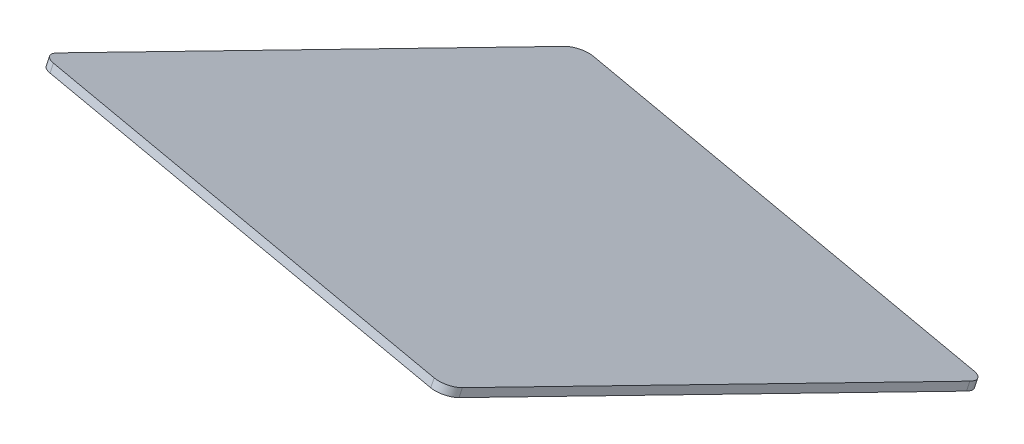
ISO-10303-21;
HEADER;
FILE_DESCRIPTION(('STEP AP214'),'2;1');
FILE_NAME('part.step','',(''),(''),'','','');
FILE_SCHEMA(('AUTOMOTIVE_DESIGN { 1 0 10303 214 1 1 1 1 }'));
ENDSEC;
DATA;
#1=APPLICATION_CONTEXT('core data for automotive mechanical design processes');
#2=APPLICATION_PROTOCOL_DEFINITION('international standard','automotive_design',2000,#1);
#3=PRODUCT_CONTEXT('',#1,'mechanical');
#4=PRODUCT('Part','Part','',(#3));
#5=PRODUCT_RELATED_PRODUCT_CATEGORY('part','',(#4));
#6=PRODUCT_DEFINITION_FORMATION('','',#4);
#7=PRODUCT_DEFINITION_CONTEXT('part definition',#1,'design');
#8=PRODUCT_DEFINITION('design','',#6,#7);
#9=PRODUCT_DEFINITION_SHAPE('','',#8);
#10=(LENGTH_UNIT() NAMED_UNIT(*) SI_UNIT(.MILLI.,.METRE.));
#11=(NAMED_UNIT(*) PLANE_ANGLE_UNIT() SI_UNIT($,.RADIAN.));
#12=(NAMED_UNIT(*) SI_UNIT($,.STERADIAN.) SOLID_ANGLE_UNIT());
#13=UNCERTAINTY_MEASURE_WITH_UNIT(LENGTH_MEASURE(1.E-05),#10,'distance_accuracy_value','');
#14=(GEOMETRIC_REPRESENTATION_CONTEXT(3) GLOBAL_UNCERTAINTY_ASSIGNED_CONTEXT((#13)) GLOBAL_UNIT_ASSIGNED_CONTEXT((#10,
#11,#12)) REPRESENTATION_CONTEXT('',''));
#15=CARTESIAN_POINT('',(0.,0.,0.));
#16=DIRECTION('',(0.,0.,1.));
#17=DIRECTION('',(1.,0.,0.));
#18=AXIS2_PLACEMENT_3D('',#15,#16,#17);
#19=CARTESIAN_POINT('',(-350.951861211952,-116.026821900405,195.378769077398));
#20=DIRECTION('',(0.0638061756262259,0.931035020271879,-0.359308451026827));
#21=DIRECTION('',(0.,0.360042105265539,0.932936054848326));
#22=AXIS2_PLACEMENT_3D('',#19,#20,#21);
#23=CYLINDRICAL_SURFACE('',#22,3.);
#24=CARTESIAN_POINT('',(-350.84977133095,-114.53716586797,194.803875555755));
#25=DIRECTION('',(-0.0638061756262259,-0.931035020271879,0.359308451026827));
#26=DIRECTION('',(0.,-0.360042105265539,-0.932936054848326));
#27=AXIS2_PLACEMENT_3D('',#24,#25,#26);
#28=CIRCLE('',#27,3.);
#29=CARTESIAN_POINT('',(-353.803559218846,-114.53716586797,194.279340415545));
#30=VERTEX_POINT('',#29);
#31=CARTESIAN_POINT('',(-350.361410746052,-115.63195539991,192.053795589668));
#32=VERTEX_POINT('',#31);
#33=EDGE_CURVE('E131',#30,#32,#28,.T.);
#34=ORIENTED_EDGE('',*,*,#33,.T.);
#35=DIRECTION('',(0.0638061756262259,0.931035020271879,-0.359308451026827));
#36=VECTOR('',#35,1.);
#37=CARTESIAN_POINT('',(-350.463500627054,-117.121611432345,192.628689111311));
#38=LINE('',#37,#36);
#39=CARTESIAN_POINT('',(-350.463500627054,-117.121611432345,192.628689111311));
#40=VERTEX_POINT('',#39);
#41=EDGE_CURVE('E11',#40,#32,#38,.T.);
#42=ORIENTED_EDGE('',*,*,#41,.F.);
#43=CARTESIAN_POINT('',(-350.951861211952,-116.026821900405,195.378769077398));
#44=DIRECTION('',(-0.0638061756262259,-0.931035020271879,0.359308451026827));
#45=DIRECTION('',(0.,-0.360042105265539,-0.932936054848326));
#46=AXIS2_PLACEMENT_3D('',#43,#44,#45);
#47=CIRCLE('',#46,3.);
#48=CARTESIAN_POINT('',(-353.905649099848,-116.026821900405,194.854233937188));
#49=VERTEX_POINT('',#48);
#50=EDGE_CURVE('E145',#49,#40,#47,.T.);
#51=ORIENTED_EDGE('',*,*,#50,.F.);
#52=DIRECTION('',(0.0638061756262259,0.931035020271879,-0.359308451026827));
#53=VECTOR('',#52,1.);
#54=CARTESIAN_POINT('',(-353.905649099848,-116.026821900405,194.854233937188));
#55=LINE('',#54,#53);
#56=EDGE_CURVE('E127',#49,#30,#55,.T.);
#57=ORIENTED_EDGE('',*,*,#56,.T.);
#58=EDGE_LOOP('',(#34,#42,#51,#57));
#59=FACE_BOUND('',#58,.T.);
#60=ADVANCED_FACE('F35',(#59),#23,.T.);
#61=CARTESIAN_POINT('',(-350.463500627054,-117.121611432345,192.628689111311));
#62=DIRECTION('',(-0.162786861632706,0.364929843980103,0.916693322028928));
#63=DIRECTION('',(0.,-0.929086162819272,0.36986335592724));
#64=AXIS2_PLACEMENT_3D('',#61,#62,#63);
#65=PLANE('',#64);
#66=DIRECTION('',(0.984595962632251,0.,0.174845046736447));
#67=VECTOR('',#66,1.);
#68=CARTESIAN_POINT('',(-350.361410746052,-115.63195539991,192.053795589668));
#69=LINE('',#68,#67);
#70=CARTESIAN_POINT('',(-257.80939025862,-115.63195539991,208.489229982894));
#71=VERTEX_POINT('',#70);
#72=EDGE_CURVE('E134',#32,#71,#69,.T.);
#73=ORIENTED_EDGE('',*,*,#72,.T.);
#74=DIRECTION('',(0.0638061756262259,0.931035020271879,-0.359308451026827));
#75=VECTOR('',#74,1.);
#76=CARTESIAN_POINT('',(-257.911480139622,-117.121611432345,209.064123504537));
#77=LINE('',#76,#75);
#78=CARTESIAN_POINT('',(-257.911480139622,-117.121611432345,209.064123504537));
#79=VERTEX_POINT('',#78);
#80=EDGE_CURVE('E43',#79,#71,#77,.T.);
#81=ORIENTED_EDGE('',*,*,#80,.F.);
#82=DIRECTION('',(0.984595962632251,0.,0.174845046736447));
#83=VECTOR('',#82,1.);
#84=CARTESIAN_POINT('',(-350.463500627054,-117.121611432345,192.628689111311));
#85=LINE('',#84,#83);
#86=EDGE_CURVE('E94',#40,#79,#85,.T.);
#87=ORIENTED_EDGE('',*,*,#86,.F.);
#88=ORIENTED_EDGE('',*,*,#41,.T.);
#89=EDGE_LOOP('',(#73,#81,#87,#88));
#90=FACE_BOUND('',#89,.T.);
#91=ADVANCED_FACE('F180',(#90),#65,.F.);
#92=CARTESIAN_POINT('',(-258.39984072452,-116.026821900405,211.814203470624));
#93=DIRECTION('',(0.0638061756262259,0.931035020271879,-0.359308451026827));
#94=DIRECTION('',(0.,0.360042105265539,0.932936054848326));
#95=AXIS2_PLACEMENT_3D('',#92,#93,#94);
#96=CYLINDRICAL_SURFACE('',#95,2.99999999999995);
#97=CARTESIAN_POINT('',(-258.297750843518,-114.53716586797,211.239309948981));
#98=DIRECTION('',(-0.0638061756262259,-0.931035020271879,0.359308451026827));
#99=DIRECTION('',(0.,-0.360042105265539,-0.932936054848326));
#100=AXIS2_PLACEMENT_3D('',#97,#98,#99);
#101=CIRCLE('',#100,2.99999999999995);
#102=CARTESIAN_POINT('',(-255.343962955621,-114.53716586797,211.76384508919));
#103=VERTEX_POINT('',#102);
#104=EDGE_CURVE('E136',#71,#103,#101,.T.);
#105=ORIENTED_EDGE('',*,*,#104,.T.);
#106=DIRECTION('',(0.0638061756262259,0.931035020271879,-0.359308451026827));
#107=VECTOR('',#106,1.);
#108=CARTESIAN_POINT('',(-255.446052836623,-116.026821900405,212.338738610833));
#109=LINE('',#108,#107);
#110=CARTESIAN_POINT('',(-255.446052836623,-116.026821900405,212.338738610833));
#111=VERTEX_POINT('',#110);
#112=EDGE_CURVE('E152',#111,#103,#109,.T.);
#113=ORIENTED_EDGE('',*,*,#112,.F.);
#114=CARTESIAN_POINT('',(-258.39984072452,-116.026821900405,211.814203470624));
#115=DIRECTION('',(-0.0638061756262259,-0.931035020271879,0.359308451026827));
#116=DIRECTION('',(0.,-0.360042105265539,-0.932936054848326));
#117=AXIS2_PLACEMENT_3D('',#114,#115,#116);
#118=CIRCLE('',#117,2.99999999999995);
#119=EDGE_CURVE('E160',#79,#111,#118,.T.);
#120=ORIENTED_EDGE('',*,*,#119,.F.);
#121=ORIENTED_EDGE('',*,*,#80,.T.);
#122=EDGE_LOOP('',(#105,#113,#120,#121));
#123=FACE_BOUND('',#122,.T.);
#124=ADVANCED_FACE('F158',(#123),#96,.T.);
#125=CARTESIAN_POINT('',(-255.446052836623,-116.026821900405,212.338738610833));
#126=DIRECTION('',(-0.984595962632251,0.,-0.174845046736447));
#127=DIRECTION('',(-0.174845046736447,0.,0.984595962632251));
#128=AXIS2_PLACEMENT_3D('',#125,#126,#127);
#129=PLANE('',#128);
#130=DIRECTION('',(-0.162786861632705,0.364929843980103,0.916693322028928));
#131=VECTOR('',#130,1.);
#132=CARTESIAN_POINT('',(-255.343962955621,-114.53716586797,211.76384508919));
#133=LINE('',#132,#131);
#134=CARTESIAN_POINT('',(-270.645927949096,-80.2337605338404,297.933017359909));
#135=VERTEX_POINT('',#134);
#136=EDGE_CURVE('E138',#103,#135,#133,.T.);
#137=ORIENTED_EDGE('',*,*,#136,.T.);
#138=DIRECTION('',(0.0638061756262259,0.931035020271879,-0.359308451026827));
#139=VECTOR('',#138,1.);
#140=CARTESIAN_POINT('',(-270.748017830098,-81.7234165662754,298.507910881552));
#141=LINE('',#140,#139);
#142=CARTESIAN_POINT('',(-270.748017830098,-81.7234165662754,298.507910881552));
#143=VERTEX_POINT('',#142);
#144=EDGE_CURVE('E149',#143,#135,#141,.T.);
#145=ORIENTED_EDGE('',*,*,#144,.F.);
#146=DIRECTION('',(-0.162786861632705,0.364929843980103,0.916693322028928));
#147=VECTOR('',#146,1.);
#148=CARTESIAN_POINT('',(-255.446052836623,-116.026821900405,212.338738610833));
#149=LINE('',#148,#147);
#150=EDGE_CURVE('E172',#111,#143,#149,.T.);
#151=ORIENTED_EDGE('',*,*,#150,.F.);
#152=ORIENTED_EDGE('',*,*,#112,.T.);
#153=EDGE_LOOP('',(#137,#145,#151,#152));
#154=FACE_BOUND('',#153,.T.);
#155=ADVANCED_FACE('F168',(#154),#129,.F.);
#156=CARTESIAN_POINT('',(-273.701805717994,-81.7234165662754,297.983375741343));
#157=DIRECTION('',(0.0638061756262259,0.931035020271879,-0.359308451026827));
#158=DIRECTION('',(0.,0.360042105265539,0.932936054848326));
#159=AXIS2_PLACEMENT_3D('',#156,#157,#158);
#160=CYLINDRICAL_SURFACE('',#159,2.99999999999997);
#161=CARTESIAN_POINT('',(-273.599715836992,-80.2337605338404,297.4084822197));
#162=DIRECTION('',(-0.0638061756262259,-0.931035020271879,0.359308451026827));
#163=DIRECTION('',(0.,-0.360042105265539,-0.932936054848326));
#164=AXIS2_PLACEMENT_3D('',#161,#162,#163);
#165=CIRCLE('',#164,2.99999999999997);
#166=CARTESIAN_POINT('',(-274.08807642189,-79.1389710019001,300.158562185787));
#167=VERTEX_POINT('',#166);
#168=EDGE_CURVE('E140',#135,#167,#165,.T.);
#169=ORIENTED_EDGE('',*,*,#168,.T.);
#170=DIRECTION('',(0.0638061756262259,0.931035020271879,-0.359308451026827));
#171=VECTOR('',#170,1.);
#172=CARTESIAN_POINT('',(-274.190166302892,-80.6286270343351,300.73345570743));
#173=LINE('',#172,#171);
#174=CARTESIAN_POINT('',(-274.190166302892,-80.6286270343351,300.73345570743));
#175=VERTEX_POINT('',#174);
#176=EDGE_CURVE('E122',#175,#167,#173,.T.);
#177=ORIENTED_EDGE('',*,*,#176,.F.);
#178=CARTESIAN_POINT('',(-273.701805717994,-81.7234165662754,297.983375741343));
#179=DIRECTION('',(-0.0638061756262259,-0.931035020271879,0.359308451026827));
#180=DIRECTION('',(0.,-0.360042105265539,-0.932936054848326));
#181=AXIS2_PLACEMENT_3D('',#178,#179,#180);
#182=CIRCLE('',#181,2.99999999999997);
#183=EDGE_CURVE('E113',#143,#175,#182,.T.);
#184=ORIENTED_EDGE('',*,*,#183,.F.);
#185=ORIENTED_EDGE('',*,*,#144,.T.);
#186=EDGE_LOOP('',(#169,#177,#184,#185));
#187=FACE_BOUND('',#186,.T.);
#188=ADVANCED_FACE('F171',(#187),#160,.T.);
#189=CARTESIAN_POINT('',(-274.190166302892,-80.6286270343351,300.73345570743));
#190=DIRECTION('',(0.162786861632705,-0.364929843980103,-0.916693322028928));
#191=DIRECTION('',(0.,0.929086162819272,-0.36986335592724));
#192=AXIS2_PLACEMENT_3D('',#189,#190,#191);
#193=PLANE('',#192);
#194=DIRECTION('',(-0.984595962632251,0.,-0.174845046736447));
#195=VECTOR('',#194,1.);
#196=CARTESIAN_POINT('',(-274.08807642189,-79.1389710019001,300.158562185787));
#197=LINE('',#196,#195);
#198=CARTESIAN_POINT('',(-366.640096909322,-79.1389710019,283.723127792561));
#199=VERTEX_POINT('',#198);
#200=EDGE_CURVE('E121',#167,#199,#197,.T.);
#201=ORIENTED_EDGE('',*,*,#200,.T.);
#202=DIRECTION('',(0.0638061756262259,0.931035020271879,-0.359308451026827));
#203=VECTOR('',#202,1.);
#204=CARTESIAN_POINT('',(-366.742186790324,-80.628627034335,284.298021314204));
#205=LINE('',#204,#203);
#206=CARTESIAN_POINT('',(-366.742186790324,-80.628627034335,284.298021314204));
#207=VERTEX_POINT('',#206);
#208=EDGE_CURVE('E118',#207,#199,#205,.T.);
#209=ORIENTED_EDGE('',*,*,#208,.F.);
#210=DIRECTION('',(-0.984595962632251,0.,-0.174845046736447));
#211=VECTOR('',#210,1.);
#212=CARTESIAN_POINT('',(-274.190166302892,-80.6286270343351,300.73345570743));
#213=LINE('',#212,#211);
#214=EDGE_CURVE('E107',#175,#207,#213,.T.);
#215=ORIENTED_EDGE('',*,*,#214,.F.);
#216=ORIENTED_EDGE('',*,*,#176,.T.);
#217=EDGE_LOOP('',(#201,#209,#215,#216));
#218=FACE_BOUND('',#217,.T.);
#219=ADVANCED_FACE('F119',(#218),#193,.F.);
#220=CARTESIAN_POINT('',(-366.253826205426,-81.7234165662754,281.547941348117));
#221=DIRECTION('',(0.0638061756262259,0.931035020271879,-0.359308451026827));
#222=DIRECTION('',(0.,0.360042105265539,0.932936054848326));
#223=AXIS2_PLACEMENT_3D('',#220,#221,#222);
#224=CYLINDRICAL_SURFACE('',#223,3.);
#225=CARTESIAN_POINT('',(-366.151736324424,-80.2337605338404,280.973047826474));
#226=DIRECTION('',(-0.0638061756262259,-0.931035020271879,0.359308451026827));
#227=DIRECTION('',(0.,-0.360042105265539,-0.932936054848326));
#228=AXIS2_PLACEMENT_3D('',#225,#226,#227);
#229=CIRCLE('',#228,3.);
#230=CARTESIAN_POINT('',(-369.105524212321,-80.2337605338404,280.448512686265));
#231=VERTEX_POINT('',#230);
#232=EDGE_CURVE('E80',#199,#231,#229,.T.);
#233=ORIENTED_EDGE('',*,*,#232,.T.);
#234=DIRECTION('',(0.0638061756262259,0.931035020271879,-0.359308451026827));
#235=VECTOR('',#234,1.);
#236=CARTESIAN_POINT('',(-369.207614093323,-81.7234165662754,281.023406207908));
#237=LINE('',#236,#235);
#238=CARTESIAN_POINT('',(-369.207614093323,-81.7234165662754,281.023406207908));
#239=VERTEX_POINT('',#238);
#240=EDGE_CURVE('E123',#239,#231,#237,.T.);
#241=ORIENTED_EDGE('',*,*,#240,.F.);
#242=CARTESIAN_POINT('',(-366.253826205426,-81.7234165662754,281.547941348117));
#243=DIRECTION('',(-0.0638061756262259,-0.931035020271879,0.359308451026827));
#244=DIRECTION('',(0.,-0.360042105265539,-0.932936054848326));
#245=AXIS2_PLACEMENT_3D('',#242,#243,#244);
#246=CIRCLE('',#245,3.);
#247=EDGE_CURVE('E111',#207,#239,#246,.T.);
#248=ORIENTED_EDGE('',*,*,#247,.F.);
#249=ORIENTED_EDGE('',*,*,#208,.T.);
#250=EDGE_LOOP('',(#233,#241,#248,#249));
#251=FACE_BOUND('',#250,.T.);
#252=ADVANCED_FACE('F125',(#251),#224,.T.);
#253=CARTESIAN_POINT('',(-369.207614093323,-81.7234165662753,281.023406207908));
#254=DIRECTION('',(0.984595962632251,0.,0.174845046736447));
#255=DIRECTION('',(0.174845046736447,0.,-0.984595962632251));
#256=AXIS2_PLACEMENT_3D('',#253,#254,#255);
#257=PLANE('',#256);
#258=DIRECTION('',(0.162786861632705,-0.364929843980103,-0.916693322028928));
#259=VECTOR('',#258,1.);
#260=CARTESIAN_POINT('',(-369.105524212321,-80.2337605338404,280.448512686265));
#261=LINE('',#260,#259);
#262=EDGE_CURVE('E86',#231,#30,#261,.T.);
#263=ORIENTED_EDGE('',*,*,#262,.T.);
#264=ORIENTED_EDGE('',*,*,#56,.F.);
#265=DIRECTION('',(0.162786861632705,-0.364929843980103,-0.916693322028928));
#266=VECTOR('',#265,1.);
#267=CARTESIAN_POINT('',(-369.207614093323,-81.7234165662753,281.023406207908));
#268=LINE('',#267,#266);
#269=EDGE_CURVE('E51',#239,#49,#268,.T.);
#270=ORIENTED_EDGE('',*,*,#269,.F.);
#271=ORIENTED_EDGE('',*,*,#240,.T.);
#272=EDGE_LOOP('',(#263,#264,#270,#271));
#273=FACE_BOUND('',#272,.T.);
#274=ADVANCED_FACE('F196',(#273),#257,.F.);
#275=CARTESIAN_POINT('',(-350.951861211952,-116.026821900405,195.378769077398));
#276=DIRECTION('',(-0.0638061756262259,-0.931035020271879,0.359308451026827));
#277=DIRECTION('',(0.,-0.360042105265539,-0.932936054848326));
#278=AXIS2_PLACEMENT_3D('',#275,#276,#277);
#279=PLANE('',#278);
#280=ORIENTED_EDGE('',*,*,#50,.T.);
#281=ORIENTED_EDGE('',*,*,#86,.T.);
#282=ORIENTED_EDGE('',*,*,#119,.T.);
#283=ORIENTED_EDGE('',*,*,#150,.T.);
#284=ORIENTED_EDGE('',*,*,#183,.T.);
#285=ORIENTED_EDGE('',*,*,#214,.T.);
#286=ORIENTED_EDGE('',*,*,#247,.T.);
#287=ORIENTED_EDGE('',*,*,#269,.T.);
#288=EDGE_LOOP('',(#280,#281,#282,#283,#284,#285,#286,#287));
#289=FACE_BOUND('',#288,.T.);
#290=ADVANCED_FACE('F109',(#289),#279,.T.);
#291=CARTESIAN_POINT('',(-350.84977133095,-114.53716586797,194.803875555755));
#292=DIRECTION('',(-0.0638061756262259,-0.931035020271879,0.359308451026827));
#293=DIRECTION('',(0.,-0.360042105265539,-0.932936054848326));
#294=AXIS2_PLACEMENT_3D('',#291,#292,#293);
#295=PLANE('',#294);
#296=ORIENTED_EDGE('',*,*,#33,.F.);
#297=ORIENTED_EDGE('',*,*,#262,.F.);
#298=ORIENTED_EDGE('',*,*,#232,.F.);
#299=ORIENTED_EDGE('',*,*,#200,.F.);
#300=ORIENTED_EDGE('',*,*,#168,.F.);
#301=ORIENTED_EDGE('',*,*,#136,.F.);
#302=ORIENTED_EDGE('',*,*,#104,.F.);
#303=ORIENTED_EDGE('',*,*,#72,.F.);
#304=EDGE_LOOP('',(#296,#297,#298,#299,#300,#301,#302,#303));
#305=FACE_BOUND('',#304,.T.);
#306=ADVANCED_FACE('F164',(#305),#295,.F.);
#307=CLOSED_SHELL('',(#60,#91,#124,#155,#188,#219,#252,#274,#290,#306));
#308=MANIFOLD_SOLID_BREP('B2',#307);
#309=ADVANCED_BREP_SHAPE_REPRESENTATION('',(#18,#308),#14);
#310=SHAPE_DEFINITION_REPRESENTATION(#9,#309);
ENDSEC;
END-ISO-10303-21;
